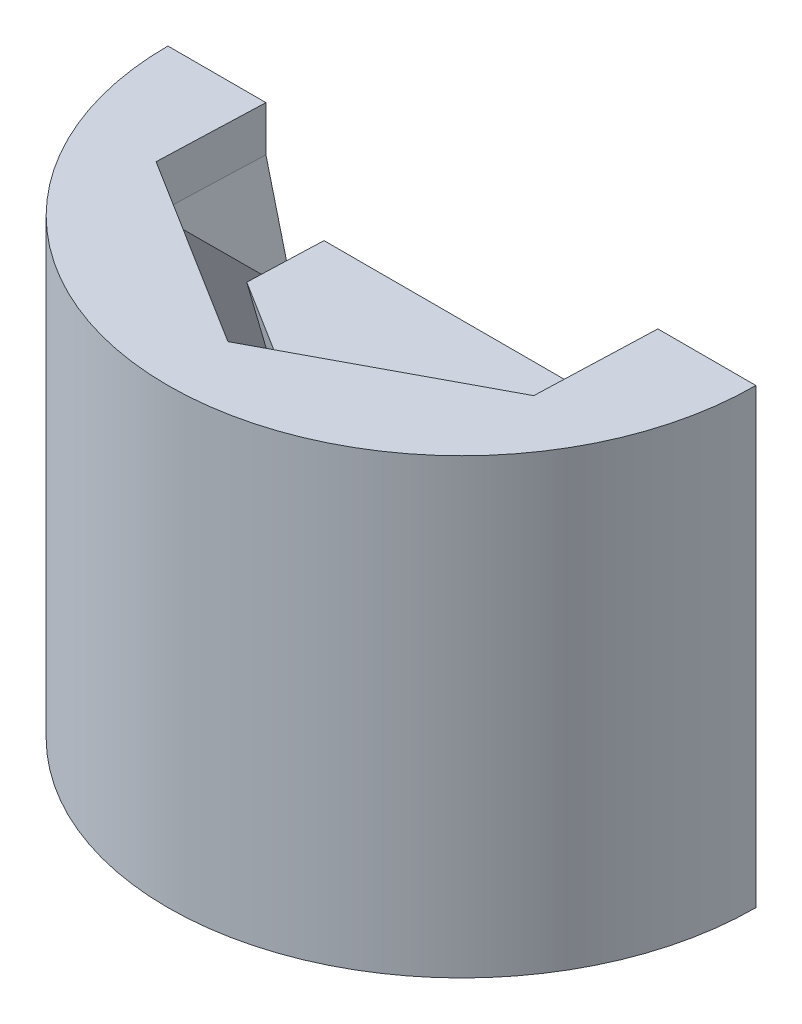
ISO-10303-21;
HEADER;
FILE_DESCRIPTION(('STEP AP214'),'2;1');
FILE_NAME('part.step','',(''),(''),'','','');
FILE_SCHEMA(('AUTOMOTIVE_DESIGN { 1 0 10303 214 1 1 1 1 }'));
ENDSEC;
DATA;
#1=APPLICATION_CONTEXT('core data for automotive mechanical design processes');
#2=APPLICATION_PROTOCOL_DEFINITION('international standard','automotive_design',2000,#1);
#3=PRODUCT_CONTEXT('',#1,'mechanical');
#4=PRODUCT('Part','Part','',(#3));
#5=PRODUCT_RELATED_PRODUCT_CATEGORY('part','',(#4));
#6=PRODUCT_DEFINITION_FORMATION('','',#4);
#7=PRODUCT_DEFINITION_CONTEXT('part definition',#1,'design');
#8=PRODUCT_DEFINITION('design','',#6,#7);
#9=PRODUCT_DEFINITION_SHAPE('','',#8);
#10=(LENGTH_UNIT() NAMED_UNIT(*) SI_UNIT(.MILLI.,.METRE.));
#11=(NAMED_UNIT(*) PLANE_ANGLE_UNIT() SI_UNIT($,.RADIAN.));
#12=(NAMED_UNIT(*) SI_UNIT($,.STERADIAN.) SOLID_ANGLE_UNIT());
#13=UNCERTAINTY_MEASURE_WITH_UNIT(LENGTH_MEASURE(1.E-05),#10,'distance_accuracy_value','');
#14=(GEOMETRIC_REPRESENTATION_CONTEXT(3) GLOBAL_UNCERTAINTY_ASSIGNED_CONTEXT((#13)) GLOBAL_UNIT_ASSIGNED_CONTEXT((#10,
#11,#12)) REPRESENTATION_CONTEXT('',''));
#15=CARTESIAN_POINT('',(0.,0.,0.));
#16=DIRECTION('',(0.,0.,1.));
#17=DIRECTION('',(1.,0.,0.));
#18=AXIS2_PLACEMENT_3D('',#15,#16,#17);
#19=CARTESIAN_POINT('',(0.,10.,0.));
#20=DIRECTION('',(0.,1.,0.));
#21=DIRECTION('',(0.,0.,1.));
#22=AXIS2_PLACEMENT_3D('',#19,#20,#21);
#23=PLANE('',#22);
#24=DIRECTION('',(1.,0.,0.));
#25=VECTOR('',#24,1.);
#26=CARTESIAN_POINT('',(-6.5,10.,0.));
#27=LINE('',#26,#25);
#28=CARTESIAN_POINT('',(-6.5,10.,0.));
#29=VERTEX_POINT('',#28);
#30=CARTESIAN_POINT('',(-4.33279053334373,10.,0.));
#31=VERTEX_POINT('',#30);
#32=EDGE_CURVE('E677',#29,#31,#27,.T.);
#33=ORIENTED_EDGE('',*,*,#32,.F.);
#34=CARTESIAN_POINT('',(0.,10.,0.));
#35=DIRECTION('',(0.,1.,0.));
#36=DIRECTION('',(0.,0.,1.));
#37=AXIS2_PLACEMENT_3D('',#34,#35,#36);
#38=CIRCLE('',#37,6.5);
#39=CARTESIAN_POINT('',(6.5,10.,0.));
#40=VERTEX_POINT('',#39);
#41=EDGE_CURVE('E241',#29,#40,#38,.T.);
#42=ORIENTED_EDGE('',*,*,#41,.T.);
#43=CARTESIAN_POINT('',(4.33279053334372,10.,0.));
#44=VERTEX_POINT('',#43);
#45=EDGE_CURVE('E825',#44,#40,#27,.T.);
#46=ORIENTED_EDGE('',*,*,#45,.F.);
#47=DIRECTION('',(0.0350583863773672,0.,-0.999385265823253));
#48=VECTOR('',#47,1.);
#49=CARTESIAN_POINT('',(4.23981917591059,10.,2.65027043065059));
#50=LINE('',#49,#48);
#51=CARTESIAN_POINT('',(4.23981917591059,10.,2.65027043065059));
#52=VERTEX_POINT('',#51);
#53=EDGE_CURVE('E304',#52,#44,#50,.T.);
#54=ORIENTED_EDGE('',*,*,#53,.F.);
#55=DIRECTION('',(0.883022221559485,0.,-0.469331179693137));
#56=VECTOR('',#55,1.);
#57=CARTESIAN_POINT('',(-0.175291931886829,10.,4.99692632911627));
#58=LINE('',#57,#56);
#59=CARTESIAN_POINT('',(-0.175291931886829,10.,4.99692632911627));
#60=VERTEX_POINT('',#59);
#61=EDGE_CURVE('E114',#60,#52,#58,.T.);
#62=ORIENTED_EDGE('',*,*,#61,.F.);
#63=DIRECTION('',(0.847963835182118,0.,0.530054086130117));
#64=VECTOR('',#63,1.);
#65=CARTESIAN_POINT('',(-4.41511110779743,10.,2.34665589846568));
#66=LINE('',#65,#64);
#67=CARTESIAN_POINT('',(-4.41511110779743,10.,2.34665589846568));
#68=VERTEX_POINT('',#67);
#69=EDGE_CURVE('E299',#68,#60,#66,.T.);
#70=ORIENTED_EDGE('',*,*,#69,.F.);
#71=DIRECTION('',(-0.035058386377364,0.,0.999385265823254));
#72=VECTOR('',#71,1.);
#73=CARTESIAN_POINT('',(-4.23981917591061,10.,-2.65027043065056));
#74=LINE('',#73,#72);
#75=EDGE_CURVE('E295',#31,#68,#74,.T.);
#76=ORIENTED_EDGE('',*,*,#75,.F.);
#77=EDGE_LOOP('',(#33,#42,#46,#54,#62,#70,#76));
#78=FACE_BOUND('',#77,.T.);
#79=ADVANCED_FACE('F45',(#78),#23,.T.);
#80=CARTESIAN_POINT('',(0.,10.,0.));
#81=DIRECTION('',(0.,-1.,0.));
#82=DIRECTION('',(0.,0.,-1.));
#83=AXIS2_PLACEMENT_3D('',#80,#81,#82);
#84=CYLINDRICAL_SURFACE('',#83,6.5);
#85=ORIENTED_EDGE('',*,*,#41,.F.);
#86=DIRECTION('',(0.,1.,0.));
#87=VECTOR('',#86,1.);
#88=CARTESIAN_POINT('',(-6.5,0.,0.));
#89=LINE('',#88,#87);
#90=CARTESIAN_POINT('',(-6.5,0.,0.));
#91=VERTEX_POINT('',#90);
#92=EDGE_CURVE('E796',#91,#29,#89,.T.);
#93=ORIENTED_EDGE('',*,*,#92,.F.);
#94=CARTESIAN_POINT('',(0.,0.,0.));
#95=DIRECTION('',(0.,1.,0.));
#96=DIRECTION('',(0.,0.,1.));
#97=AXIS2_PLACEMENT_3D('',#94,#95,#96);
#98=CIRCLE('',#97,6.5);
#99=CARTESIAN_POINT('',(6.5,0.,0.));
#100=VERTEX_POINT('',#99);
#101=EDGE_CURVE('E183',#91,#100,#98,.T.);
#102=ORIENTED_EDGE('',*,*,#101,.T.);
#103=DIRECTION('',(0.,1.,0.));
#104=VECTOR('',#103,1.);
#105=CARTESIAN_POINT('',(6.5,0.,0.));
#106=LINE('',#105,#104);
#107=EDGE_CURVE('E788',#100,#40,#106,.T.);
#108=ORIENTED_EDGE('',*,*,#107,.T.);
#109=EDGE_LOOP('',(#85,#93,#102,#108));
#110=FACE_BOUND('',#109,.T.);
#111=ADVANCED_FACE('F47',(#110),#84,.T.);
#112=CARTESIAN_POINT('',(0.,0.,0.));
#113=DIRECTION('',(0.,1.,0.));
#114=DIRECTION('',(0.,0.,1.));
#115=AXIS2_PLACEMENT_3D('',#112,#113,#114);
#116=PLANE('',#115);
#117=CARTESIAN_POINT('',(0.,0.,3.));
#118=DIRECTION('',(0.,-1.,0.));
#119=DIRECTION('',(0.,0.,-1.));
#120=AXIS2_PLACEMENT_3D('',#117,#118,#119);
#121=CIRCLE('',#120,0.5);
#122=CARTESIAN_POINT('',(0.,0.,2.5));
#123=VERTEX_POINT('',#122);
#124=EDGE_CURVE('E250',#123,#123,#121,.T.);
#125=ORIENTED_EDGE('',*,*,#124,.F.);
#126=EDGE_LOOP('',(#125));
#127=FACE_BOUND('',#126,.T.);
#128=ORIENTED_EDGE('',*,*,#101,.F.);
#129=DIRECTION('',(1.,0.,0.));
#130=VECTOR('',#129,1.);
#131=CARTESIAN_POINT('',(-6.5,0.,0.));
#132=LINE('',#131,#130);
#133=EDGE_CURVE('E821',#91,#100,#132,.T.);
#134=ORIENTED_EDGE('',*,*,#133,.T.);
#135=EDGE_LOOP('',(#128,#134));
#136=FACE_BOUND('',#135,.T.);
#137=ADVANCED_FACE('F367',(#127,#136),#116,.F.);
#138=CARTESIAN_POINT('',(0.714114391473475,1.97069847256846,1.34356911215401));
#139=DIRECTION('',(0.455015238775917,-0.245102602639358,0.856087522780883));
#140=DIRECTION('',(-0.122622151561338,-0.969461310102613,-0.212387796637647));
#141=AXIS2_PLACEMENT_3D('',#138,#139,#140);
#142=PLANE('',#141);
#143=DIRECTION('',(0.701158993357544,0.691256268371221,-0.174759370196078));
#144=VECTOR('',#143,1.);
#145=CARTESIAN_POINT('',(-0.997437338533875,4.09016567240614,2.86008350051742));
#146=LINE('',#145,#144);
#147=CARTESIAN_POINT('',(-1.74275971543633,3.35536975611325,3.04585031006342));
#148=VERTEX_POINT('',#147);
#149=CARTESIAN_POINT('',(2.96840807475976,8.,1.87162203416241));
#150=VERTEX_POINT('',#149);
#151=EDGE_CURVE('E143',#148,#150,#146,.T.);
#152=ORIENTED_EDGE('',*,*,#151,.T.);
#153=DIRECTION('',(0.883022221559484,0.,-0.46933117969314));
#154=VECTOR('',#153,1.);
#155=CARTESIAN_POINT('',(1.42951251919078,8.,2.68955350732984));
#156=LINE('',#155,#154);
#157=CARTESIAN_POINT('',(-0.12983850766219,8.,3.518357176275));
#158=VERTEX_POINT('',#157);
#159=EDGE_CURVE('E192',#158,#150,#156,.T.);
#160=ORIENTED_EDGE('',*,*,#159,.F.);
#161=DIRECTION('',(-0.328763367848374,-0.939692620785908,-0.0942996627857473));
#162=VECTOR('',#161,1.);
#163=CARTESIAN_POINT('',(-1.96871431464146,2.74400679835749,2.99090982215558));
#164=LINE('',#163,#162);
#165=CARTESIAN_POINT('',(-1.75482123883819,3.35536975611325,3.05226107625807));
#166=VERTEX_POINT('',#165);
#167=EDGE_CURVE('E331',#158,#166,#164,.T.);
#168=ORIENTED_EDGE('',*,*,#167,.T.);
#169=DIRECTION('',(-0.883022221559484,0.,0.46933117969314));
#170=VECTOR('',#169,1.);
#171=CARTESIAN_POINT('',(0.878410577233129,3.35536975611325,1.65268384652579));
#172=LINE('',#171,#170);
#173=EDGE_CURVE('E168',#148,#166,#172,.T.);
#174=ORIENTED_EDGE('',*,*,#173,.F.);
#175=EDGE_LOOP('',(#152,#160,#168,#174));
#176=FACE_BOUND('',#175,.T.);
#177=ADVANCED_FACE('F365',(#176),#142,.T.);
#178=CARTESIAN_POINT('',(1.52062217860222,1.97069847256846,0.0533433518529181));
#179=DIRECTION('',(0.968901161979092,-0.245102602639358,0.0339890055014594));
#180=DIRECTION('',(-0.245244303122675,-0.969461310102613,0.));
#181=AXIS2_PLACEMENT_3D('',#178,#179,#180);
#182=PLANE('',#181);
#183=DIRECTION('',(-0.245244303122675,-0.969461310102613,0.));
#184=VECTOR('',#183,1.);
#185=CARTESIAN_POINT('',(1.52238091295021,1.97025356612913,0.));
#186=LINE('',#185,#184);
#187=CARTESIAN_POINT('',(3.04772385007534,8.,0.));
#188=VERTEX_POINT('',#187);
#189=CARTESIAN_POINT('',(2.63613392179215,6.37296725747441,0.));
#190=VERTEX_POINT('',#189);
#191=EDGE_CURVE('E808',#188,#190,#186,.T.);
#192=ORIENTED_EDGE('',*,*,#191,.F.);
#193=DIRECTION('',(0.0350583863773682,0.,-0.999385265823254));
#194=VECTOR('',#193,1.);
#195=CARTESIAN_POINT('',(3.04397792178056,8.,0.10678259701783));
#196=LINE('',#195,#194);
#197=CARTESIAN_POINT('',(2.98206744041033,8.,1.87162203416241));
#198=VERTEX_POINT('',#197);
#199=EDGE_CURVE('E158',#198,#188,#196,.T.);
#200=ORIENTED_EDGE('',*,*,#199,.F.);
#201=DIRECTION('',(-0.246047587464951,-0.939692620785908,0.237567596997547));
#202=VECTOR('',#201,1.);
#203=CARTESIAN_POINT('',(1.60584672909439,2.7440067983575,3.20041152035136));
#204=LINE('',#203,#202);
#205=CARTESIAN_POINT('',(1.76592501160281,3.35536975611325,3.04585031006339));
#206=VERTEX_POINT('',#205);
#207=EDGE_CURVE('E140',#198,#206,#204,.T.);
#208=ORIENTED_EDGE('',*,*,#207,.T.);
#209=DIRECTION('',(-0.0350583863773682,0.,0.999385265823254));
#210=VECTOR('',#209,1.);
#211=CARTESIAN_POINT('',(1.87047148413208,3.35536975611325,0.0656160484260624));
#212=LINE('',#211,#210);
#213=CARTESIAN_POINT('',(1.76640388692145,3.35536975611325,3.03219934129172));
#214=VERTEX_POINT('',#213);
#215=EDGE_CURVE('E155',#214,#206,#212,.T.);
#216=ORIENTED_EDGE('',*,*,#215,.F.);
#217=DIRECTION('',(0.199233442539602,0.691256268371221,-0.694601185437596));
#218=VECTOR('',#217,1.);
#219=CARTESIAN_POINT('',(1.97818629912586,4.09016567240614,2.29384782411219));
#220=LINE('',#219,#218);
#221=EDGE_CURVE('E320',#214,#190,#220,.T.);
#222=ORIENTED_EDGE('',*,*,#221,.T.);
#223=EDGE_LOOP('',(#192,#200,#208,#216,#222));
#224=FACE_BOUND('',#223,.T.);
#225=ADVANCED_FACE('F153',(#224),#182,.T.);
#226=CARTESIAN_POINT('',(0.,8.,0.));
#227=DIRECTION('',(0.,1.,0.));
#228=DIRECTION('',(0.,0.,1.));
#229=AXIS2_PLACEMENT_3D('',#226,#227,#228);
#230=PLANE('',#229);
#231=DIRECTION('',(1.,0.,0.));
#232=VECTOR('',#231,1.);
#233=CARTESIAN_POINT('',(0.,8.,0.));
#234=LINE('',#233,#232);
#235=CARTESIAN_POINT('',(-3.04772385007534,8.,0.));
#236=VERTEX_POINT('',#235);
#237=EDGE_CURVE('E805',#236,#188,#234,.T.);
#238=ORIENTED_EDGE('',*,*,#237,.F.);
#239=DIRECTION('',(-0.0350583863773682,0.,0.999385265823254));
#240=VECTOR('',#239,1.);
#241=CARTESIAN_POINT('',(-3.04397792178056,8.,-0.10678259701783));
#242=LINE('',#241,#240);
#243=CARTESIAN_POINT('',(-3.10507626524724,8.,1.63490578445959));
#244=VERTEX_POINT('',#243);
#245=EDGE_CURVE('E160',#236,#244,#242,.T.);
#246=ORIENTED_EDGE('',*,*,#245,.T.);
#247=DIRECTION('',(-0.499999999999995,0.,0.866025403784442));
#248=VECTOR('',#247,1.);
#249=CARTESIAN_POINT('',(-1.62087222786739,8.,-0.935811017081212));
#250=LINE('',#249,#248);
#251=CARTESIAN_POINT('',(-3.11190594807253,8.,1.64673514211258));
#252=VERTEX_POINT('',#251);
#253=EDGE_CURVE('E169',#244,#252,#250,.T.);
#254=ORIENTED_EDGE('',*,*,#253,.T.);
#255=DIRECTION('',(0.847963835182119,0.,0.530054086130116));
#256=VECTOR('',#255,1.);
#257=CARTESIAN_POINT('',(-1.61446540258979,8.,2.58277091031202));
#258=LINE('',#257,#256);
#259=CARTESIAN_POINT('',(-0.136668190487485,8.,3.50652781862201));
#260=VERTEX_POINT('',#259);
#261=EDGE_CURVE('E131',#252,#260,#258,.T.);
#262=ORIENTED_EDGE('',*,*,#261,.T.);
#263=DIRECTION('',(0.500000000000007,0.,0.866025403784435));
#264=VECTOR('',#263,1.);
#265=CARTESIAN_POINT('',(-1.62087222786737,8.,0.935811017081235));
#266=LINE('',#265,#264);
#267=EDGE_CURVE('E176',#260,#158,#266,.T.);
#268=ORIENTED_EDGE('',*,*,#267,.T.);
#269=ORIENTED_EDGE('',*,*,#159,.T.);
#270=DIRECTION('',(1.,0.,0.));
#271=VECTOR('',#270,1.);
#272=CARTESIAN_POINT('',(0.,8.,1.87162203416244));
#273=LINE('',#272,#271);
#274=EDGE_CURVE('E352',#150,#198,#273,.T.);
#275=ORIENTED_EDGE('',*,*,#274,.T.);
#276=ORIENTED_EDGE('',*,*,#199,.T.);
#277=EDGE_LOOP('',(#238,#246,#254,#262,#268,#269,#275,#276));
#278=FACE_BOUND('',#277,.T.);
#279=ADVANCED_FACE('F358',(#278),#230,.T.);
#280=CARTESIAN_POINT('',(2.68510852169906,3.13921910073164,1.55024812780629));
#281=DIRECTION('',(0.839609156473752,0.245102602639355,0.484748572504189));
#282=DIRECTION('',(0.499999999999995,0.,-0.866025403784442));
#283=AXIS2_PLACEMENT_3D('',#280,#281,#282);
#284=PLANE('',#283);
#285=DIRECTION('',(0.280228216547104,-0.9599334074043,0.));
#286=VECTOR('',#285,1.);
#287=CARTESIAN_POINT('',(3.50985942619252,3.37998421347708,0.));
#288=LINE('',#287,#286);
#289=CARTESIAN_POINT('',(3.51704499285281,3.35536975611325,0.));
#290=VERTEX_POINT('',#289);
#291=EDGE_CURVE('E811',#190,#290,#288,.T.);
#292=ORIENTED_EDGE('',*,*,#291,.F.);
#293=ORIENTED_EDGE('',*,*,#221,.F.);
#294=DIRECTION('',(0.499999999999995,0.,-0.866025403784442));
#295=VECTOR('',#294,1.);
#296=CARTESIAN_POINT('',(2.63778374463963,3.35536975611325,1.52292515503169));
#297=LINE('',#296,#295);
#298=EDGE_CURVE('E166',#214,#290,#297,.T.);
#299=ORIENTED_EDGE('',*,*,#298,.T.);
#300=EDGE_LOOP('',(#292,#293,#299));
#301=FACE_BOUND('',#300,.T.);
#302=ADVANCED_FACE('F436',(#301),#284,.T.);
#303=CARTESIAN_POINT('',(-2.68510852169904,3.13921910073164,1.55024812780633));
#304=DIRECTION('',(-0.839609156473745,0.245102602639355,0.484748572504201));
#305=DIRECTION('',(0.500000000000007,0.,0.866025403784435));
#306=AXIS2_PLACEMENT_3D('',#303,#304,#305);
#307=PLANE('',#306);
#308=DIRECTION('',(-0.501925550817944,-0.691256268371221,-0.51984181524152));
#309=VECTOR('',#308,1.);
#310=CARTESIAN_POINT('',(-2.97562363765975,4.09016567240614,0.566235676405229));
#311=LINE('',#310,#309);
#312=CARTESIAN_POINT('',(-3.5091636023578,3.35536975611325,0.0136509687717015));
#313=VERTEX_POINT('',#312);
#314=EDGE_CURVE('E326',#260,#313,#311,.T.);
#315=ORIENTED_EDGE('',*,*,#314,.T.);
#316=DIRECTION('',(0.500000000000007,0.,0.866025403784435));
#317=VECTOR('',#316,1.);
#318=CARTESIAN_POINT('',(-2.63778374463961,3.35536975611325,1.52292515503172));
#319=LINE('',#318,#317);
#320=EDGE_CURVE('E149',#313,#166,#319,.T.);
#321=ORIENTED_EDGE('',*,*,#320,.T.);
#322=ORIENTED_EDGE('',*,*,#167,.F.);
#323=ORIENTED_EDGE('',*,*,#267,.F.);
#324=EDGE_LOOP('',(#315,#321,#322,#323));
#325=FACE_BOUND('',#324,.T.);
#326=ADVANCED_FACE('F361',(#325),#307,.T.);
#327=CARTESIAN_POINT('',(0.,3.13921910073164,3.10049625561261));
#328=DIRECTION('',(0.,0.245102602639355,0.969497145008388));
#329=DIRECTION('',(1.,0.,0.));
#330=AXIS2_PLACEMENT_3D('',#327,#328,#329);
#331=PLANE('',#330);
#332=ORIENTED_EDGE('',*,*,#151,.F.);
#333=DIRECTION('',(1.,0.,0.));
#334=VECTOR('',#333,1.);
#335=CARTESIAN_POINT('',(0.,3.35536975611325,3.04585031006341));
#336=LINE('',#335,#334);
#337=EDGE_CURVE('E137',#148,#206,#336,.T.);
#338=ORIENTED_EDGE('',*,*,#337,.T.);
#339=ORIENTED_EDGE('',*,*,#207,.F.);
#340=ORIENTED_EDGE('',*,*,#274,.F.);
#341=EDGE_LOOP('',(#332,#338,#339,#340));
#342=FACE_BOUND('',#341,.T.);
#343=ADVANCED_FACE('F139',(#342),#331,.T.);
#344=CARTESIAN_POINT('',(-1.52062217860222,1.97069847256846,-0.0533433518529181));
#345=DIRECTION('',(-0.968901161979092,-0.245102602639358,-0.0339890055014594));
#346=DIRECTION('',(0.245244303122675,-0.969461310102613,0.));
#347=AXIS2_PLACEMENT_3D('',#344,#345,#346);
#348=PLANE('',#347);
#349=DIRECTION('',(-0.245244303122675,0.969461310102613,0.));
#350=VECTOR('',#349,1.);
#351=CARTESIAN_POINT('',(-1.52238091295021,1.97025356612913,0.));
#352=LINE('',#351,#350);
#353=CARTESIAN_POINT('',(-2.63613392179215,6.37296725747441,0.));
#354=VERTEX_POINT('',#353);
#355=EDGE_CURVE('E802',#354,#236,#352,.T.);
#356=ORIENTED_EDGE('',*,*,#355,.F.);
#357=DIRECTION('',(-0.199233442539602,0.691256268371221,0.694601185437596));
#358=VECTOR('',#357,1.);
#359=CARTESIAN_POINT('',(-1.97818629912586,4.09016567240614,-2.29384782411219));
#360=LINE('',#359,#358);
#361=EDGE_CURVE('E148',#354,#244,#360,.T.);
#362=ORIENTED_EDGE('',*,*,#361,.T.);
#363=ORIENTED_EDGE('',*,*,#245,.F.);
#364=EDGE_LOOP('',(#356,#362,#363));
#365=FACE_BOUND('',#364,.T.);
#366=ADVANCED_FACE('F429',(#365),#348,.T.);
#367=CARTESIAN_POINT('',(-0.806507787128743,1.97069847256846,1.2902257603011));
#368=DIRECTION('',(-0.513885923203177,-0.245102602639358,0.822098517279427));
#369=DIRECTION('',(0.122622151561337,-0.969461310102613,-0.212387796637648));
#370=AXIS2_PLACEMENT_3D('',#367,#368,#369);
#371=PLANE('',#370);
#372=ORIENTED_EDGE('',*,*,#314,.F.);
#373=ORIENTED_EDGE('',*,*,#261,.F.);
#374=DIRECTION('',(-0.082715780383423,-0.939692620785908,-0.331867259783294));
#375=VECTOR('',#374,1.);
#376=CARTESIAN_POINT('',(-3.57456104373586,2.74400679835749,-0.209501698195787));
#377=LINE('',#376,#375);
#378=CARTESIAN_POINT('',(-3.52074625044102,3.35536975611325,0.00641076619466922));
#379=VERTEX_POINT('',#378);
#380=EDGE_CURVE('E342',#252,#379,#377,.T.);
#381=ORIENTED_EDGE('',*,*,#380,.T.);
#382=DIRECTION('',(-0.847963835182119,0.,-0.530054086130116));
#383=VECTOR('',#382,1.);
#384=CARTESIAN_POINT('',(-0.992060906898957,3.35536975611325,1.58706779809974));
#385=LINE('',#384,#383);
#386=EDGE_CURVE('E173',#313,#379,#385,.T.);
#387=ORIENTED_EDGE('',*,*,#386,.F.);
#388=EDGE_LOOP('',(#372,#373,#381,#387));
#389=FACE_BOUND('',#388,.T.);
#390=ADVANCED_FACE('F362',(#389),#371,.T.);
#391=CARTESIAN_POINT('',(0.,3.35536975611325,0.));
#392=DIRECTION('',(0.,1.,0.));
#393=DIRECTION('',(0.,0.,1.));
#394=AXIS2_PLACEMENT_3D('',#391,#392,#393);
#395=PLANE('',#394);
#396=DIRECTION('',(0.499999999999995,0.,-0.866025403784442));
#397=VECTOR('',#396,1.);
#398=CARTESIAN_POINT('',(-2.63778374463963,3.35536975611325,-1.52292515503169));
#399=LINE('',#398,#397);
#400=CARTESIAN_POINT('',(-3.51704499285281,3.35536975611325,0.));
#401=VERTEX_POINT('',#400);
#402=EDGE_CURVE('E63',#379,#401,#399,.T.);
#403=ORIENTED_EDGE('',*,*,#402,.T.);
#404=DIRECTION('',(1.,0.,0.));
#405=VECTOR('',#404,1.);
#406=CARTESIAN_POINT('',(0.,3.35536975611325,0.));
#407=LINE('',#406,#405);
#408=CARTESIAN_POINT('',(-1.,3.35536975611325,0.));
#409=VERTEX_POINT('',#408);
#410=EDGE_CURVE('E787',#401,#409,#407,.T.);
#411=ORIENTED_EDGE('',*,*,#410,.T.);
#412=CARTESIAN_POINT('',(0.,3.35536975611325,0.));
#413=DIRECTION('',(0.,1.,0.));
#414=DIRECTION('',(0.,0.,1.));
#415=AXIS2_PLACEMENT_3D('',#412,#413,#414);
#416=CIRCLE('',#415,1.);
#417=CARTESIAN_POINT('',(1.,3.35536975611325,0.));
#418=VERTEX_POINT('',#417);
#419=EDGE_CURVE('E235',#409,#418,#416,.T.);
#420=ORIENTED_EDGE('',*,*,#419,.T.);
#421=EDGE_CURVE('E794',#418,#290,#407,.T.);
#422=ORIENTED_EDGE('',*,*,#421,.T.);
#423=ORIENTED_EDGE('',*,*,#298,.F.);
#424=ORIENTED_EDGE('',*,*,#215,.T.);
#425=ORIENTED_EDGE('',*,*,#337,.F.);
#426=ORIENTED_EDGE('',*,*,#173,.T.);
#427=ORIENTED_EDGE('',*,*,#320,.F.);
#428=ORIENTED_EDGE('',*,*,#386,.T.);
#429=EDGE_LOOP('',(#403,#411,#420,#422,#423,#424,#425,#426,#427,#428));
#430=FACE_BOUND('',#429,.T.);
#431=ADVANCED_FACE('F163',(#430),#395,.F.);
#432=CARTESIAN_POINT('',(-2.68510852169906,3.13921910073164,-1.55024812780629));
#433=DIRECTION('',(-0.839609156473752,0.245102602639355,-0.484748572504189));
#434=DIRECTION('',(-0.499999999999995,0.,0.866025403784442));
#435=AXIS2_PLACEMENT_3D('',#432,#433,#434);
#436=PLANE('',#435);
#437=DIRECTION('',(0.280228216547104,0.9599334074043,0.));
#438=VECTOR('',#437,1.);
#439=CARTESIAN_POINT('',(-3.50985942619252,3.37998421347708,0.));
#440=LINE('',#439,#438);
#441=EDGE_CURVE('E792',#401,#354,#440,.T.);
#442=ORIENTED_EDGE('',*,*,#441,.F.);
#443=ORIENTED_EDGE('',*,*,#402,.F.);
#444=ORIENTED_EDGE('',*,*,#380,.F.);
#445=ORIENTED_EDGE('',*,*,#253,.F.);
#446=ORIENTED_EDGE('',*,*,#361,.F.);
#447=EDGE_LOOP('',(#442,#443,#444,#445,#446));
#448=FACE_BOUND('',#447,.T.);
#449=ADVANCED_FACE('F377',(#448),#436,.T.);
#450=CARTESIAN_POINT('',(0.,6.35536975611325,0.));
#451=DIRECTION('',(0.,-1.,0.));
#452=DIRECTION('',(0.,0.,-1.));
#453=AXIS2_PLACEMENT_3D('',#450,#451,#452);
#454=CYLINDRICAL_SURFACE('',#453,1.);
#455=DIRECTION('',(0.,-1.,0.));
#456=VECTOR('',#455,1.);
#457=CARTESIAN_POINT('',(-1.,6.35536975611325,0.));
#458=LINE('',#457,#456);
#459=CARTESIAN_POINT('',(-1.,1.35536975611325,0.));
#460=VERTEX_POINT('',#459);
#461=EDGE_CURVE('E782',#460,#409,#458,.F.);
#462=ORIENTED_EDGE('',*,*,#461,.F.);
#463=CARTESIAN_POINT('',(0.,1.35536975611325,0.));
#464=DIRECTION('',(0.,-1.,0.));
#465=DIRECTION('',(0.,0.,-1.));
#466=AXIS2_PLACEMENT_3D('',#463,#464,#465);
#467=CIRCLE('',#466,1.);
#468=CARTESIAN_POINT('',(1.,1.35536975611325,0.));
#469=VERTEX_POINT('',#468);
#470=EDGE_CURVE('E240',#469,#460,#467,.T.);
#471=ORIENTED_EDGE('',*,*,#470,.F.);
#472=DIRECTION('',(0.,-1.,0.));
#473=VECTOR('',#472,1.);
#474=CARTESIAN_POINT('',(1.,6.35536975611325,0.));
#475=LINE('',#474,#473);
#476=EDGE_CURVE('E769',#418,#469,#475,.T.);
#477=ORIENTED_EDGE('',*,*,#476,.F.);
#478=ORIENTED_EDGE('',*,*,#419,.F.);
#479=EDGE_LOOP('',(#462,#471,#477,#478));
#480=FACE_BOUND('',#479,.T.);
#481=ADVANCED_FACE('F369',(#480),#454,.T.);
#482=CARTESIAN_POINT('',(1.16912963024939,1.7255958699291,2.1996566349349));
#483=DIRECTION('',(0.455015238775917,-0.245102602639358,0.856087522780883));
#484=DIRECTION('',(-0.122622151561338,-0.969461310102613,-0.212387796637647));
#485=AXIS2_PLACEMENT_3D('',#482,#483,#484);
#486=PLANE('',#485);
#487=DIRECTION('',(0.701158993357544,0.691256268371221,-0.174759370196078));
#488=VECTOR('',#487,1.);
#489=CARTESIAN_POINT('',(4.2398191759106,9.,2.65027043065057));
#490=LINE('',#489,#488);
#491=CARTESIAN_POINT('',(-2.49999999999996,2.35536975611325,4.33012701892221));
#492=VERTEX_POINT('',#491);
#493=CARTESIAN_POINT('',(4.23981917591059,9.,2.65027043065059));
#494=VERTEX_POINT('',#493);
#495=EDGE_CURVE('E214',#492,#494,#490,.T.);
#496=ORIENTED_EDGE('',*,*,#495,.F.);
#497=DIRECTION('',(-0.328763367848374,-0.939692620785909,-0.0942996627857466));
#498=VECTOR('',#497,1.);
#499=CARTESIAN_POINT('',(-2.49999999999996,2.35536975611325,4.33012701892221));
#500=LINE('',#499,#498);
#501=CARTESIAN_POINT('',(-0.175291931886829,9.,4.99692632911627));
#502=VERTEX_POINT('',#501);
#503=EDGE_CURVE('E218',#502,#492,#500,.T.);
#504=ORIENTED_EDGE('',*,*,#503,.F.);
#505=DIRECTION('',(0.883022221559486,0.,-0.469331179693135));
#506=VECTOR('',#505,1.);
#507=CARTESIAN_POINT('',(-0.175291931886845,9.,4.99692632911627));
#508=LINE('',#507,#506);
#509=EDGE_CURVE('E228',#502,#494,#508,.T.);
#510=ORIENTED_EDGE('',*,*,#509,.T.);
#511=EDGE_LOOP('',(#496,#504,#510));
#512=FACE_BOUND('',#511,.T.);
#513=ADVANCED_FACE('F380',(#512),#486,.F.);
#514=CARTESIAN_POINT('',(2.48952334058131,1.7255958699291,0.0873323573543775));
#515=DIRECTION('',(0.968901161979092,-0.245102602639358,0.0339890055014594));
#516=DIRECTION('',(-0.245244303122675,-0.969461310102613,0.));
#517=AXIS2_PLACEMENT_3D('',#514,#515,#516);
#518=PLANE('',#517);
#519=DIRECTION('',(0.0350583863773684,0.,-0.999385265823254));
#520=VECTOR('',#519,1.);
#521=CARTESIAN_POINT('',(4.23981917591059,9.,2.65027043065059));
#522=LINE('',#521,#520);
#523=CARTESIAN_POINT('',(4.33279053334372,9.,0.));
#524=VERTEX_POINT('',#523);
#525=EDGE_CURVE('E227',#494,#524,#522,.T.);
#526=ORIENTED_EDGE('',*,*,#525,.T.);
#527=DIRECTION('',(-0.245244303122675,-0.969461310102613,0.));
#528=VECTOR('',#527,1.);
#529=CARTESIAN_POINT('',(2.49240269501321,1.72486748060223,0.));
#530=LINE('',#529,#528);
#531=CARTESIAN_POINT('',(3.74201647031472,6.66464464280643,0.));
#532=VERTEX_POINT('',#531);
#533=EDGE_CURVE('E761',#524,#532,#530,.T.);
#534=ORIENTED_EDGE('',*,*,#533,.T.);
#535=DIRECTION('',(0.199233442539603,0.691256268371221,-0.694601185437596));
#536=VECTOR('',#535,1.);
#537=CARTESIAN_POINT('',(4.41511110779743,9.,-2.34665589846568));
#538=LINE('',#537,#536);
#539=CARTESIAN_POINT('',(2.50000000000002,2.35536975611325,4.33012701892217));
#540=VERTEX_POINT('',#539);
#541=EDGE_CURVE('E223',#540,#532,#538,.T.);
#542=ORIENTED_EDGE('',*,*,#541,.F.);
#543=DIRECTION('',(-0.246047587464949,-0.939692620785909,0.237567596997547));
#544=VECTOR('',#543,1.);
#545=CARTESIAN_POINT('',(2.50000000000005,2.35536975611325,4.33012701892216));
#546=LINE('',#545,#544);
#547=EDGE_CURVE('E105',#494,#540,#546,.T.);
#548=ORIENTED_EDGE('',*,*,#547,.F.);
#549=EDGE_LOOP('',(#526,#534,#542,#548));
#550=FACE_BOUND('',#549,.T.);
#551=ADVANCED_FACE('F395',(#550),#518,.F.);
#552=CARTESIAN_POINT('',(3.52471767817281,3.38432170337099,2.03499670031048));
#553=DIRECTION('',(0.839609156473752,0.245102602639355,0.484748572504189));
#554=DIRECTION('',(0.499999999999995,0.,-0.866025403784442));
#555=AXIS2_PLACEMENT_3D('',#552,#553,#554);
#556=PLANE('',#555);
#557=ORIENTED_EDGE('',*,*,#541,.T.);
#558=DIRECTION('',(0.280228216547104,-0.9599334074043,0.));
#559=VECTOR('',#558,1.);
#560=CARTESIAN_POINT('',(4.60736073325412,3.7003718899177,0.));
#561=LINE('',#560,#559);
#562=CARTESIAN_POINT('',(4.99999999999996,2.35536975611325,0.));
#563=VERTEX_POINT('',#562);
#564=EDGE_CURVE('E752',#532,#563,#561,.T.);
#565=ORIENTED_EDGE('',*,*,#564,.T.);
#566=DIRECTION('',(0.499999999999995,0.,-0.866025403784441));
#567=VECTOR('',#566,1.);
#568=CARTESIAN_POINT('',(2.50000000000005,2.35536975611325,4.33012701892216));
#569=LINE('',#568,#567);
#570=EDGE_CURVE('E193',#540,#563,#569,.T.);
#571=ORIENTED_EDGE('',*,*,#570,.F.);
#572=EDGE_LOOP('',(#557,#565,#571));
#573=FACE_BOUND('',#572,.T.);
#574=ADVANCED_FACE('F399',(#573),#556,.F.);
#575=CARTESIAN_POINT('',(-3.52471767817278,3.38432170337099,2.03499670031053));
#576=DIRECTION('',(-0.839609156473745,0.245102602639355,0.484748572504201));
#577=DIRECTION('',(0.500000000000007,0.,0.866025403784435));
#578=AXIS2_PLACEMENT_3D('',#575,#576,#577);
#579=PLANE('',#578);
#580=DIRECTION('',(-0.501925550817944,-0.691256268371221,-0.51984181524152));
#581=VECTOR('',#580,1.);
#582=CARTESIAN_POINT('',(-0.17529193188683,9.,4.99692632911627));
#583=LINE('',#582,#581);
#584=CARTESIAN_POINT('',(-4.99999999999997,2.35536975611325,0.));
#585=VERTEX_POINT('',#584);
#586=EDGE_CURVE('E97',#502,#585,#583,.T.);
#587=ORIENTED_EDGE('',*,*,#586,.F.);
#588=ORIENTED_EDGE('',*,*,#503,.T.);
#589=DIRECTION('',(0.500000000000007,0.,0.866025403784434));
#590=VECTOR('',#589,1.);
#591=CARTESIAN_POINT('',(-4.99999999999999,2.35536975611325,0.));
#592=LINE('',#591,#590);
#593=EDGE_CURVE('E197',#585,#492,#592,.T.);
#594=ORIENTED_EDGE('',*,*,#593,.F.);
#595=EDGE_LOOP('',(#587,#588,#594));
#596=FACE_BOUND('',#595,.T.);
#597=ADVANCED_FACE('F402',(#596),#579,.F.);
#598=CARTESIAN_POINT('',(0.,3.38432170337099,4.069993400621));
#599=DIRECTION('',(0.,0.245102602639355,0.969497145008388));
#600=DIRECTION('',(1.,0.,0.));
#601=AXIS2_PLACEMENT_3D('',#598,#599,#600);
#602=PLANE('',#601);
#603=ORIENTED_EDGE('',*,*,#495,.T.);
#604=ORIENTED_EDGE('',*,*,#547,.T.);
#605=DIRECTION('',(1.,0.,0.));
#606=VECTOR('',#605,1.);
#607=CARTESIAN_POINT('',(-2.49999999999996,2.35536975611325,4.33012701892221));
#608=LINE('',#607,#606);
#609=EDGE_CURVE('E188',#492,#540,#608,.T.);
#610=ORIENTED_EDGE('',*,*,#609,.F.);
#611=EDGE_LOOP('',(#603,#604,#610));
#612=FACE_BOUND('',#611,.T.);
#613=ADVANCED_FACE('F406',(#612),#602,.F.);
#614=CARTESIAN_POINT('',(-2.48952334058131,1.7255958699291,-0.0873323573543775));
#615=DIRECTION('',(-0.968901161979092,-0.245102602639358,-0.0339890055014594));
#616=DIRECTION('',(0.245244303122675,-0.969461310102613,0.));
#617=AXIS2_PLACEMENT_3D('',#614,#615,#616);
#618=PLANE('',#617);
#619=DIRECTION('',(-0.199233442539603,0.691256268371221,0.694601185437596));
#620=VECTOR('',#619,1.);
#621=CARTESIAN_POINT('',(-4.41511110779743,9.,2.34665589846568));
#622=LINE('',#621,#620);
#623=CARTESIAN_POINT('',(-3.74201647031472,6.66464464280643,0.));
#624=VERTEX_POINT('',#623);
#625=CARTESIAN_POINT('',(-4.41511110779743,9.,2.34665589846568));
#626=VERTEX_POINT('',#625);
#627=EDGE_CURVE('E184',#624,#626,#622,.T.);
#628=ORIENTED_EDGE('',*,*,#627,.F.);
#629=DIRECTION('',(-0.245244303122675,0.969461310102613,0.));
#630=VECTOR('',#629,1.);
#631=CARTESIAN_POINT('',(-2.49240269501321,1.72486748060223,0.));
#632=LINE('',#631,#630);
#633=CARTESIAN_POINT('',(-4.33279053334373,9.,0.));
#634=VERTEX_POINT('',#633);
#635=EDGE_CURVE('E264',#624,#634,#632,.T.);
#636=ORIENTED_EDGE('',*,*,#635,.T.);
#637=DIRECTION('',(-0.0350583863773682,0.,0.999385265823253));
#638=VECTOR('',#637,1.);
#639=CARTESIAN_POINT('',(-4.23981917591059,9.,-2.6502704306506));
#640=LINE('',#639,#638);
#641=EDGE_CURVE('E207',#634,#626,#640,.T.);
#642=ORIENTED_EDGE('',*,*,#641,.T.);
#643=EDGE_LOOP('',(#628,#636,#642));
#644=FACE_BOUND('',#643,.T.);
#645=ADVANCED_FACE('F409',(#644),#618,.F.);
#646=CARTESIAN_POINT('',(-1.32039371033192,1.7255958699291,2.11232427758053));
#647=DIRECTION('',(-0.513885923203177,-0.245102602639358,0.822098517279427));
#648=DIRECTION('',(0.122622151561337,-0.969461310102613,-0.212387796637648));
#649=AXIS2_PLACEMENT_3D('',#646,#647,#648);
#650=PLANE('',#649);
#651=ORIENTED_EDGE('',*,*,#586,.T.);
#652=DIRECTION('',(-0.0827157803834235,-0.939692620785909,-0.331867259783293));
#653=VECTOR('',#652,1.);
#654=CARTESIAN_POINT('',(-4.99999999999999,2.35536975611325,0.));
#655=LINE('',#654,#653);
#656=EDGE_CURVE('E187',#626,#585,#655,.T.);
#657=ORIENTED_EDGE('',*,*,#656,.F.);
#658=DIRECTION('',(0.847963835182119,0.,0.530054086130116));
#659=VECTOR('',#658,1.);
#660=CARTESIAN_POINT('',(-4.41511110779743,9.,2.34665589846569));
#661=LINE('',#660,#659);
#662=EDGE_CURVE('E198',#626,#502,#661,.T.);
#663=ORIENTED_EDGE('',*,*,#662,.T.);
#664=EDGE_LOOP('',(#651,#657,#663));
#665=FACE_BOUND('',#664,.T.);
#666=ADVANCED_FACE('F413',(#665),#650,.F.);
#667=CARTESIAN_POINT('',(-3.52471767817281,3.38432170337099,-2.03499670031048));
#668=DIRECTION('',(-0.839609156473752,0.245102602639355,-0.484748572504189));
#669=DIRECTION('',(-0.499999999999995,0.,0.866025403784442));
#670=AXIS2_PLACEMENT_3D('',#667,#668,#669);
#671=PLANE('',#670);
#672=ORIENTED_EDGE('',*,*,#656,.T.);
#673=DIRECTION('',(0.280228216547104,0.9599334074043,0.));
#674=VECTOR('',#673,1.);
#675=CARTESIAN_POINT('',(-4.60736073325412,3.7003718899177,0.));
#676=LINE('',#675,#674);
#677=EDGE_CURVE('E258',#585,#624,#676,.T.);
#678=ORIENTED_EDGE('',*,*,#677,.T.);
#679=ORIENTED_EDGE('',*,*,#627,.T.);
#680=EDGE_LOOP('',(#672,#678,#679));
#681=FACE_BOUND('',#680,.T.);
#682=ADVANCED_FACE('F417',(#681),#671,.F.);
#683=CARTESIAN_POINT('',(-4.23981917591061,10.,-2.65027043065056));
#684=DIRECTION('',(0.999385265823254,0.,0.035058386377364));
#685=DIRECTION('',(0.035058386377364,0.,-0.999385265823254));
#686=AXIS2_PLACEMENT_3D('',#683,#684,#685);
#687=PLANE('',#686);
#688=DIRECTION('',(0.,-1.,0.));
#689=VECTOR('',#688,1.);
#690=CARTESIAN_POINT('',(-4.33279053334373,10.,0.));
#691=LINE('',#690,#689);
#692=EDGE_CURVE('E673',#31,#634,#691,.T.);
#693=ORIENTED_EDGE('',*,*,#692,.F.);
#694=ORIENTED_EDGE('',*,*,#75,.T.);
#695=DIRECTION('',(0.,-1.,0.));
#696=VECTOR('',#695,1.);
#697=CARTESIAN_POINT('',(-4.41511110779743,10.,2.34665589846568));
#698=LINE('',#697,#696);
#699=EDGE_CURVE('E232',#68,#626,#698,.T.);
#700=ORIENTED_EDGE('',*,*,#699,.T.);
#701=ORIENTED_EDGE('',*,*,#641,.F.);
#702=EDGE_LOOP('',(#693,#694,#700,#701));
#703=FACE_BOUND('',#702,.T.);
#704=ADVANCED_FACE('F421',(#703),#687,.T.);
#705=CARTESIAN_POINT('',(-4.41511110779743,10.,2.34665589846568));
#706=DIRECTION('',(0.530054086130117,0.,-0.847963835182118));
#707=DIRECTION('',(-0.847963835182118,0.,-0.530054086130117));
#708=AXIS2_PLACEMENT_3D('',#705,#706,#707);
#709=PLANE('',#708);
#710=ORIENTED_EDGE('',*,*,#662,.F.);
#711=ORIENTED_EDGE('',*,*,#699,.F.);
#712=ORIENTED_EDGE('',*,*,#69,.T.);
#713=DIRECTION('',(0.,-1.,0.));
#714=VECTOR('',#713,1.);
#715=CARTESIAN_POINT('',(-0.175291931886829,10.,4.99692632911627));
#716=LINE('',#715,#714);
#717=EDGE_CURVE('E311',#60,#502,#716,.T.);
#718=ORIENTED_EDGE('',*,*,#717,.T.);
#719=EDGE_LOOP('',(#710,#711,#712,#718));
#720=FACE_BOUND('',#719,.T.);
#721=ADVANCED_FACE('F512',(#720),#709,.T.);
#722=CARTESIAN_POINT('',(-0.175291931886829,10.,4.99692632911627));
#723=DIRECTION('',(-0.469331179693137,0.,-0.883022221559485));
#724=DIRECTION('',(-0.883022221559485,0.,0.469331179693137));
#725=AXIS2_PLACEMENT_3D('',#722,#723,#724);
#726=PLANE('',#725);
#727=ORIENTED_EDGE('',*,*,#509,.F.);
#728=ORIENTED_EDGE('',*,*,#717,.F.);
#729=ORIENTED_EDGE('',*,*,#61,.T.);
#730=DIRECTION('',(0.,-1.,0.));
#731=VECTOR('',#730,1.);
#732=CARTESIAN_POINT('',(4.23981917591059,10.,2.65027043065059));
#733=LINE('',#732,#731);
#734=EDGE_CURVE('E308',#52,#494,#733,.T.);
#735=ORIENTED_EDGE('',*,*,#734,.T.);
#736=EDGE_LOOP('',(#727,#728,#729,#735));
#737=FACE_BOUND('',#736,.T.);
#738=ADVANCED_FACE('F523',(#737),#726,.T.);
#739=CARTESIAN_POINT('',(4.23981917591059,10.,2.65027043065059));
#740=DIRECTION('',(-0.999385265823254,0.,-0.0350583863773672));
#741=DIRECTION('',(-0.0350583863773672,0.,0.999385265823254));
#742=AXIS2_PLACEMENT_3D('',#739,#740,#741);
#743=PLANE('',#742);
#744=DIRECTION('',(0.,1.,0.));
#745=VECTOR('',#744,1.);
#746=CARTESIAN_POINT('',(4.33279053334372,10.,0.));
#747=LINE('',#746,#745);
#748=EDGE_CURVE('E764',#524,#44,#747,.T.);
#749=ORIENTED_EDGE('',*,*,#748,.F.);
#750=ORIENTED_EDGE('',*,*,#525,.F.);
#751=ORIENTED_EDGE('',*,*,#734,.F.);
#752=ORIENTED_EDGE('',*,*,#53,.T.);
#753=EDGE_LOOP('',(#749,#750,#751,#752));
#754=FACE_BOUND('',#753,.T.);
#755=ADVANCED_FACE('F518',(#754),#743,.T.);
#756=CARTESIAN_POINT('',(2.50000000000002,1.35536975611325,4.33012701892217));
#757=DIRECTION('',(0.,0.,-1.));
#758=DIRECTION('',(-1.,0.,0.));
#759=AXIS2_PLACEMENT_3D('',#756,#757,#758);
#760=PLANE('',#759);
#761=ORIENTED_EDGE('',*,*,#609,.T.);
#762=DIRECTION('',(0.,1.,0.));
#763=VECTOR('',#762,1.);
#764=CARTESIAN_POINT('',(2.50000000000002,1.35536975611325,4.33012701892217));
#765=LINE('',#764,#763);
#766=CARTESIAN_POINT('',(2.50000000000002,1.35536975611325,4.33012701892217));
#767=VERTEX_POINT('',#766);
#768=EDGE_CURVE('E279',#767,#540,#765,.T.);
#769=ORIENTED_EDGE('',*,*,#768,.F.);
#770=DIRECTION('',(-1.,0.,0.));
#771=VECTOR('',#770,1.);
#772=CARTESIAN_POINT('',(2.50000000000002,1.35536975611325,4.33012701892217));
#773=LINE('',#772,#771);
#774=CARTESIAN_POINT('',(-2.49999999999996,1.35536975611325,4.33012701892221));
#775=VERTEX_POINT('',#774);
#776=EDGE_CURVE('E239',#767,#775,#773,.T.);
#777=ORIENTED_EDGE('',*,*,#776,.T.);
#778=DIRECTION('',(0.,1.,0.));
#779=VECTOR('',#778,1.);
#780=CARTESIAN_POINT('',(-2.49999999999996,1.35536975611325,4.33012701892221));
#781=LINE('',#780,#779);
#782=EDGE_CURVE('E291',#775,#492,#781,.T.);
#783=ORIENTED_EDGE('',*,*,#782,.T.);
#784=EDGE_LOOP('',(#761,#769,#777,#783));
#785=FACE_BOUND('',#784,.T.);
#786=ADVANCED_FACE('F522',(#785),#760,.T.);
#787=CARTESIAN_POINT('',(-2.49999999999996,1.35536975611325,4.33012701892221));
#788=DIRECTION('',(0.866025403784435,0.,-0.500000000000007));
#789=DIRECTION('',(-0.500000000000007,0.,-0.866025403784434));
#790=AXIS2_PLACEMENT_3D('',#787,#788,#789);
#791=PLANE('',#790);
#792=ORIENTED_EDGE('',*,*,#593,.T.);
#793=ORIENTED_EDGE('',*,*,#782,.F.);
#794=DIRECTION('',(-0.500000000000007,0.,-0.866025403784434));
#795=VECTOR('',#794,1.);
#796=CARTESIAN_POINT('',(-2.49999999999996,1.35536975611325,4.33012701892221));
#797=LINE('',#796,#795);
#798=CARTESIAN_POINT('',(-4.99999999999999,1.35536975611325,0.));
#799=VERTEX_POINT('',#798);
#800=EDGE_CURVE('E271',#775,#799,#797,.T.);
#801=ORIENTED_EDGE('',*,*,#800,.T.);
#802=DIRECTION('',(0.,1.,0.));
#803=VECTOR('',#802,1.);
#804=CARTESIAN_POINT('',(-4.99999999999999,1.35536975611325,0.));
#805=LINE('',#804,#803);
#806=EDGE_CURVE('E287',#799,#585,#805,.T.);
#807=ORIENTED_EDGE('',*,*,#806,.T.);
#808=EDGE_LOOP('',(#792,#793,#801,#807));
#809=FACE_BOUND('',#808,.T.);
#810=ADVANCED_FACE('F531',(#809),#791,.T.);
#811=CARTESIAN_POINT('',(4.99999999999999,1.35536975611325,0.));
#812=DIRECTION('',(-0.866025403784443,0.,-0.499999999999993));
#813=DIRECTION('',(-0.499999999999993,0.,0.866025403784443));
#814=AXIS2_PLACEMENT_3D('',#811,#812,#813);
#815=PLANE('',#814);
#816=ORIENTED_EDGE('',*,*,#570,.T.);
#817=DIRECTION('',(0.,1.,0.));
#818=VECTOR('',#817,1.);
#819=CARTESIAN_POINT('',(4.99999999999999,1.35536975611325,0.));
#820=LINE('',#819,#818);
#821=CARTESIAN_POINT('',(4.99999999999999,1.35536975611325,0.));
#822=VERTEX_POINT('',#821);
#823=EDGE_CURVE('E283',#822,#563,#820,.T.);
#824=ORIENTED_EDGE('',*,*,#823,.F.);
#825=DIRECTION('',(-0.499999999999993,0.,0.866025403784443));
#826=VECTOR('',#825,1.);
#827=CARTESIAN_POINT('',(4.99999999999999,1.35536975611325,0.));
#828=LINE('',#827,#826);
#829=EDGE_CURVE('E275',#822,#767,#828,.T.);
#830=ORIENTED_EDGE('',*,*,#829,.T.);
#831=ORIENTED_EDGE('',*,*,#768,.T.);
#832=EDGE_LOOP('',(#816,#824,#830,#831));
#833=FACE_BOUND('',#832,.T.);
#834=ADVANCED_FACE('F535',(#833),#815,.T.);
#835=CARTESIAN_POINT('',(0.,1.35536975611325,0.));
#836=DIRECTION('',(0.,-1.,0.));
#837=DIRECTION('',(0.,0.,-1.));
#838=AXIS2_PLACEMENT_3D('',#835,#836,#837);
#839=PLANE('',#838);
#840=CARTESIAN_POINT('',(0.,1.35536975611325,3.));
#841=DIRECTION('',(0.,-1.,0.));
#842=DIRECTION('',(0.,0.,-1.));
#843=AXIS2_PLACEMENT_3D('',#840,#841,#842);
#844=CIRCLE('',#843,0.5);
#845=CARTESIAN_POINT('',(0.,1.35536975611325,2.5));
#846=VERTEX_POINT('',#845);
#847=EDGE_CURVE('E247',#846,#846,#844,.T.);
#848=ORIENTED_EDGE('',*,*,#847,.T.);
#849=EDGE_LOOP('',(#848));
#850=FACE_BOUND('',#849,.T.);
#851=ORIENTED_EDGE('',*,*,#829,.F.);
#852=DIRECTION('',(-1.,0.,0.));
#853=VECTOR('',#852,1.);
#854=CARTESIAN_POINT('',(0.,1.35536975611325,0.));
#855=LINE('',#854,#853);
#856=EDGE_CURVE('E11',#822,#469,#855,.T.);
#857=ORIENTED_EDGE('',*,*,#856,.T.);
#858=ORIENTED_EDGE('',*,*,#470,.T.);
#859=EDGE_CURVE('E49',#460,#799,#855,.T.);
#860=ORIENTED_EDGE('',*,*,#859,.T.);
#861=ORIENTED_EDGE('',*,*,#800,.F.);
#862=ORIENTED_EDGE('',*,*,#776,.F.);
#863=EDGE_LOOP('',(#851,#857,#858,#860,#861,#862));
#864=FACE_BOUND('',#863,.T.);
#865=ADVANCED_FACE('F544',(#850,#864),#839,.F.);
#866=CARTESIAN_POINT('',(0.,3.,3.));
#867=DIRECTION('',(0.,-1.,0.));
#868=DIRECTION('',(0.,0.,-1.));
#869=AXIS2_PLACEMENT_3D('',#866,#867,#868);
#870=CYLINDRICAL_SURFACE('',#869,0.5);
#871=ORIENTED_EDGE('',*,*,#124,.T.);
#872=EDGE_LOOP('',(#871));
#873=FACE_BOUND('',#872,.T.);
#874=ORIENTED_EDGE('',*,*,#847,.F.);
#875=EDGE_LOOP('',(#874));
#876=FACE_BOUND('',#875,.T.);
#877=ADVANCED_FACE('F553',(#873,#876),#870,.F.);
#878=CARTESIAN_POINT('',(-6.5,0.,0.));
#879=DIRECTION('',(0.,0.,1.));
#880=DIRECTION('',(1.,0.,0.));
#881=AXIS2_PLACEMENT_3D('',#878,#879,#880);
#882=PLANE('',#881);
#883=ORIENTED_EDGE('',*,*,#806,.F.);
#884=ORIENTED_EDGE('',*,*,#859,.F.);
#885=ORIENTED_EDGE('',*,*,#461,.T.);
#886=ORIENTED_EDGE('',*,*,#410,.F.);
#887=ORIENTED_EDGE('',*,*,#441,.T.);
#888=ORIENTED_EDGE('',*,*,#355,.T.);
#889=ORIENTED_EDGE('',*,*,#237,.T.);
#890=ORIENTED_EDGE('',*,*,#191,.T.);
#891=ORIENTED_EDGE('',*,*,#291,.T.);
#892=ORIENTED_EDGE('',*,*,#421,.F.);
#893=ORIENTED_EDGE('',*,*,#476,.T.);
#894=ORIENTED_EDGE('',*,*,#856,.F.);
#895=ORIENTED_EDGE('',*,*,#823,.T.);
#896=ORIENTED_EDGE('',*,*,#564,.F.);
#897=ORIENTED_EDGE('',*,*,#533,.F.);
#898=ORIENTED_EDGE('',*,*,#748,.T.);
#899=ORIENTED_EDGE('',*,*,#45,.T.);
#900=ORIENTED_EDGE('',*,*,#107,.F.);
#901=ORIENTED_EDGE('',*,*,#133,.F.);
#902=ORIENTED_EDGE('',*,*,#92,.T.);
#903=ORIENTED_EDGE('',*,*,#32,.T.);
#904=ORIENTED_EDGE('',*,*,#692,.T.);
#905=ORIENTED_EDGE('',*,*,#635,.F.);
#906=ORIENTED_EDGE('',*,*,#677,.F.);
#907=EDGE_LOOP('',(#883,#884,#885,#886,#887,#888,#889,#890,#891,#892,#893,#894,#895,#896,#897,
#898,#899,#900,#901,#902,#903,#904,#905,#906));
#908=FACE_BOUND('',#907,.T.);
#909=ADVANCED_FACE('F559',(#908),#882,.F.);
#910=CLOSED_SHELL('',(#79,#111,#137,#177,#225,#279,#302,#326,#343,#366,#390,#431,#449,#481,#513,
#551,#574,#597,#613,#645,#666,#682,#704,#721,#738,#755,#786,#810,#834,#865,#877,#909));
#911=MANIFOLD_SOLID_BREP('B2',#910);
#912=ADVANCED_BREP_SHAPE_REPRESENTATION('',(#18,#911),#14);
#913=SHAPE_DEFINITION_REPRESENTATION(#9,#912);
ENDSEC;
END-ISO-10303-21;
